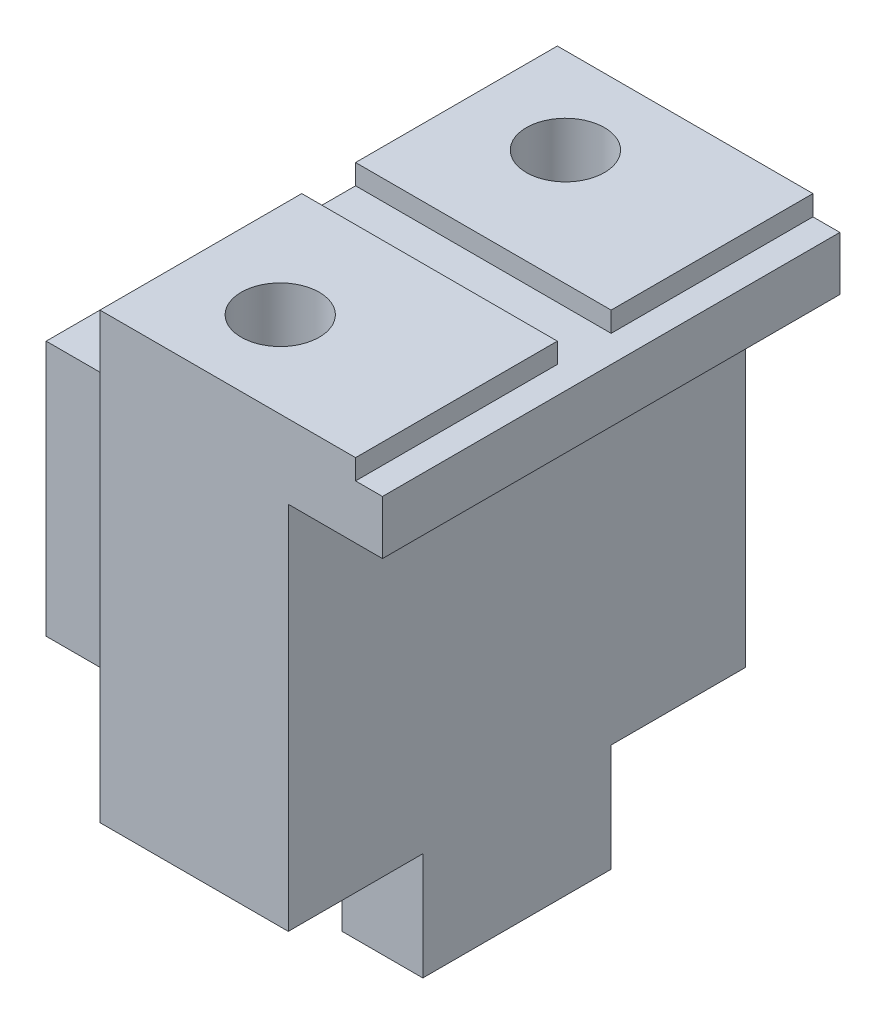
ISO-10303-21;
HEADER;
FILE_DESCRIPTION(('STEP AP214'),'2;1');
FILE_NAME('part.step','',(''),(''),'','','');
FILE_SCHEMA(('AUTOMOTIVE_DESIGN { 1 0 10303 214 1 1 1 1 }'));
ENDSEC;
DATA;
#1=APPLICATION_CONTEXT('core data for automotive mechanical design processes');
#2=APPLICATION_PROTOCOL_DEFINITION('international standard','automotive_design',2000,#1);
#3=PRODUCT_CONTEXT('',#1,'mechanical');
#4=PRODUCT('Part','Part','',(#3));
#5=PRODUCT_RELATED_PRODUCT_CATEGORY('part','',(#4));
#6=PRODUCT_DEFINITION_FORMATION('','',#4);
#7=PRODUCT_DEFINITION_CONTEXT('part definition',#1,'design');
#8=PRODUCT_DEFINITION('design','',#6,#7);
#9=PRODUCT_DEFINITION_SHAPE('','',#8);
#10=(LENGTH_UNIT() NAMED_UNIT(*) SI_UNIT(.MILLI.,.METRE.));
#11=(NAMED_UNIT(*) PLANE_ANGLE_UNIT() SI_UNIT($,.RADIAN.));
#12=(NAMED_UNIT(*) SI_UNIT($,.STERADIAN.) SOLID_ANGLE_UNIT());
#13=UNCERTAINTY_MEASURE_WITH_UNIT(LENGTH_MEASURE(1.E-05),#10,'distance_accuracy_value','');
#14=(GEOMETRIC_REPRESENTATION_CONTEXT(3) GLOBAL_UNCERTAINTY_ASSIGNED_CONTEXT((#13)) GLOBAL_UNIT_ASSIGNED_CONTEXT((#10,
#11,#12)) REPRESENTATION_CONTEXT('',''));
#15=CARTESIAN_POINT('',(0.,0.,0.));
#16=DIRECTION('',(0.,0.,1.));
#17=DIRECTION('',(1.,0.,0.));
#18=AXIS2_PLACEMENT_3D('',#15,#16,#17);
#19=CARTESIAN_POINT('',(9.5,15.75,7.));
#20=DIRECTION('',(-1.,0.,0.));
#21=DIRECTION('',(0.,0.,1.));
#22=AXIS2_PLACEMENT_3D('',#19,#20,#21);
#23=PLANE('',#22);
#24=DIRECTION('',(0.,0.,-1.));
#25=VECTOR('',#24,1.);
#26=CARTESIAN_POINT('',(9.5,15.75,7.));
#27=LINE('',#26,#25);
#28=CARTESIAN_POINT('',(9.5,15.75,12.));
#29=VERTEX_POINT('',#28);
#30=CARTESIAN_POINT('',(9.5,15.75,4.5));
#31=VERTEX_POINT('',#30);
#32=EDGE_CURVE('E172',#29,#31,#27,.T.);
#33=ORIENTED_EDGE('',*,*,#32,.T.);
#34=DIRECTION('',(0.,-1.,0.));
#35=VECTOR('',#34,1.);
#36=CARTESIAN_POINT('',(9.5,15.75,4.5));
#37=LINE('',#36,#35);
#38=CARTESIAN_POINT('',(9.5,16.5,4.5));
#39=VERTEX_POINT('',#38);
#40=EDGE_CURVE('E180',#39,#31,#37,.T.);
#41=ORIENTED_EDGE('',*,*,#40,.F.);
#42=DIRECTION('',(0.,0.,-1.));
#43=VECTOR('',#42,1.);
#44=CARTESIAN_POINT('',(9.5,16.5,7.));
#45=LINE('',#44,#43);
#46=CARTESIAN_POINT('',(9.5,16.5,12.));
#47=VERTEX_POINT('',#46);
#48=EDGE_CURVE('E195',#47,#39,#45,.T.);
#49=ORIENTED_EDGE('',*,*,#48,.F.);
#50=DIRECTION('',(0.,1.,0.));
#51=VECTOR('',#50,1.);
#52=CARTESIAN_POINT('',(9.5,15.75,12.));
#53=LINE('',#52,#51);
#54=EDGE_CURVE('E189',#29,#47,#53,.T.);
#55=ORIENTED_EDGE('',*,*,#54,.F.);
#56=EDGE_LOOP('',(#33,#41,#49,#55));
#57=FACE_BOUND('',#56,.T.);
#58=ADVANCED_FACE('F32',(#57),#23,.F.);
#59=CARTESIAN_POINT('',(7.,16.5,7.));
#60=DIRECTION('',(0.,-1.,0.));
#61=DIRECTION('',(0.,0.,-1.));
#62=AXIS2_PLACEMENT_3D('',#59,#60,#61);
#63=PLANE('',#62);
#64=CARTESIAN_POINT('',(3.5,16.5,8.8));
#65=DIRECTION('',(0.,1.,0.));
#66=DIRECTION('',(0.,0.,-1.));
#67=AXIS2_PLACEMENT_3D('',#64,#65,#66);
#68=CIRCLE('',#67,1.45);
#69=CARTESIAN_POINT('',(3.5,16.5,7.35));
#70=VERTEX_POINT('',#69);
#71=EDGE_CURVE('E337',#70,#70,#68,.T.);
#72=ORIENTED_EDGE('',*,*,#71,.F.);
#73=EDGE_LOOP('',(#72));
#74=FACE_BOUND('',#73,.T.);
#75=ORIENTED_EDGE('',*,*,#48,.T.);
#76=DIRECTION('',(1.,0.,0.));
#77=VECTOR('',#76,1.);
#78=CARTESIAN_POINT('',(-0.499999999999999,16.5,4.5));
#79=LINE('',#78,#77);
#80=CARTESIAN_POINT('',(0.,16.5,4.5));
#81=VERTEX_POINT('',#80);
#82=EDGE_CURVE('E183',#81,#39,#79,.T.);
#83=ORIENTED_EDGE('',*,*,#82,.F.);
#84=DIRECTION('',(0.,0.,-1.));
#85=VECTOR('',#84,1.);
#86=CARTESIAN_POINT('',(0.,16.5,7.));
#87=LINE('',#86,#85);
#88=CARTESIAN_POINT('',(0.,16.5,12.));
#89=VERTEX_POINT('',#88);
#90=EDGE_CURVE('E237',#89,#81,#87,.T.);
#91=ORIENTED_EDGE('',*,*,#90,.F.);
#92=DIRECTION('',(-1.,0.,0.));
#93=VECTOR('',#92,1.);
#94=CARTESIAN_POINT('',(9.5,16.5,12.));
#95=LINE('',#94,#93);
#96=EDGE_CURVE('E333',#47,#89,#95,.T.);
#97=ORIENTED_EDGE('',*,*,#96,.F.);
#98=EDGE_LOOP('',(#75,#83,#91,#97));
#99=FACE_BOUND('',#98,.T.);
#100=ADVANCED_FACE('F394',(#74,#99),#63,.F.);
#101=CARTESIAN_POINT('',(0.,0.,7.));
#102=DIRECTION('',(0.,0.,-1.));
#103=DIRECTION('',(-1.,0.,0.));
#104=AXIS2_PLACEMENT_3D('',#101,#102,#103);
#105=PLANE('',#104);
#106=DIRECTION('',(0.,1.,0.));
#107=VECTOR('',#106,1.);
#108=CARTESIAN_POINT('',(7.,0.,7.));
#109=LINE('',#108,#107);
#110=CARTESIAN_POINT('',(7.,-4.,7.));
#111=VERTEX_POINT('',#110);
#112=CARTESIAN_POINT('',(7.,0.,7.));
#113=VERTEX_POINT('',#112);
#114=EDGE_CURVE('E55',#111,#113,#109,.T.);
#115=ORIENTED_EDGE('',*,*,#114,.T.);
#116=DIRECTION('',(-1.,0.,0.));
#117=VECTOR('',#116,1.);
#118=CARTESIAN_POINT('',(0.,0.,7.));
#119=LINE('',#118,#117);
#120=CARTESIAN_POINT('',(4.,0.,7.));
#121=VERTEX_POINT('',#120);
#122=EDGE_CURVE('E281',#113,#121,#119,.T.);
#123=ORIENTED_EDGE('',*,*,#122,.T.);
#124=DIRECTION('',(0.,-1.,0.));
#125=VECTOR('',#124,1.);
#126=CARTESIAN_POINT('',(4.,0.,7.));
#127=LINE('',#126,#125);
#128=CARTESIAN_POINT('',(4.,-4.,7.));
#129=VERTEX_POINT('',#128);
#130=EDGE_CURVE('E273',#121,#129,#127,.T.);
#131=ORIENTED_EDGE('',*,*,#130,.T.);
#132=DIRECTION('',(1.,0.,0.));
#133=VECTOR('',#132,1.);
#134=CARTESIAN_POINT('',(7.,-4.,7.));
#135=LINE('',#134,#133);
#136=EDGE_CURVE('E271',#129,#111,#135,.T.);
#137=ORIENTED_EDGE('',*,*,#136,.T.);
#138=EDGE_LOOP('',(#115,#123,#131,#137));
#139=FACE_BOUND('',#138,.T.);
#140=ADVANCED_FACE('F383',(#139),#105,.F.);
#141=CARTESIAN_POINT('',(0.,0.,0.));
#142=DIRECTION('',(0.,0.,-1.));
#143=DIRECTION('',(-1.,0.,0.));
#144=AXIS2_PLACEMENT_3D('',#141,#142,#143);
#145=PLANE('',#144);
#146=DIRECTION('',(-1.,0.,0.));
#147=VECTOR('',#146,1.);
#148=CARTESIAN_POINT('',(0.,0.,0.));
#149=LINE('',#148,#147);
#150=CARTESIAN_POINT('',(7.,0.,0.));
#151=VERTEX_POINT('',#150);
#152=CARTESIAN_POINT('',(4.,0.,0.));
#153=VERTEX_POINT('',#152);
#154=EDGE_CURVE('E218',#151,#153,#149,.T.);
#155=ORIENTED_EDGE('',*,*,#154,.F.);
#156=DIRECTION('',(0.,1.,0.));
#157=VECTOR('',#156,1.);
#158=CARTESIAN_POINT('',(7.,0.,0.));
#159=LINE('',#158,#157);
#160=CARTESIAN_POINT('',(7.,-4.,0.));
#161=VERTEX_POINT('',#160);
#162=EDGE_CURVE('E256',#161,#151,#159,.T.);
#163=ORIENTED_EDGE('',*,*,#162,.F.);
#164=DIRECTION('',(1.,0.,0.));
#165=VECTOR('',#164,1.);
#166=CARTESIAN_POINT('',(7.,-4.,0.));
#167=LINE('',#166,#165);
#168=CARTESIAN_POINT('',(4.,-4.,0.));
#169=VERTEX_POINT('',#168);
#170=EDGE_CURVE('E259',#169,#161,#167,.T.);
#171=ORIENTED_EDGE('',*,*,#170,.F.);
#172=DIRECTION('',(0.,-1.,0.));
#173=VECTOR('',#172,1.);
#174=CARTESIAN_POINT('',(4.,0.,0.));
#175=LINE('',#174,#173);
#176=EDGE_CURVE('E262',#153,#169,#175,.T.);
#177=ORIENTED_EDGE('',*,*,#176,.F.);
#178=EDGE_LOOP('',(#155,#163,#171,#177));
#179=FACE_BOUND('',#178,.T.);
#180=ADVANCED_FACE('F390',(#179),#145,.T.);
#181=CARTESIAN_POINT('',(-3.5,-4.40000000000001,3.5));
#182=DIRECTION('',(0.,1.,0.));
#183=DIRECTION('',(-1.,0.,0.));
#184=AXIS2_PLACEMENT_3D('',#181,#182,#183);
#185=CYLINDRICAL_SURFACE('',#184,1.6);
#186=CARTESIAN_POINT('',(-3.5,0.,3.5));
#187=DIRECTION('',(0.,1.,0.));
#188=DIRECTION('',(0.,0.,1.));
#189=AXIS2_PLACEMENT_3D('',#186,#187,#188);
#190=CIRCLE('',#189,1.6);
#191=CARTESIAN_POINT('',(-3.5,0.,5.1));
#192=VERTEX_POINT('',#191);
#193=EDGE_CURVE('E215',#192,#192,#190,.T.);
#194=ORIENTED_EDGE('',*,*,#193,.F.);
#195=EDGE_LOOP('',(#194));
#196=FACE_BOUND('',#195,.T.);
#197=CARTESIAN_POINT('',(-3.5,6.5,3.5));
#198=DIRECTION('',(0.,1.,0.));
#199=DIRECTION('',(-1.,0.,0.));
#200=AXIS2_PLACEMENT_3D('',#197,#198,#199);
#201=CIRCLE('',#200,1.6);
#202=CARTESIAN_POINT('',(-5.1,6.5,3.5));
#203=VERTEX_POINT('',#202);
#204=EDGE_CURVE('E212',#203,#203,#201,.F.);
#205=ORIENTED_EDGE('',*,*,#204,.F.);
#206=EDGE_LOOP('',(#205));
#207=FACE_BOUND('',#206,.T.);
#208=ADVANCED_FACE('F433',(#196,#207),#185,.F.);
#209=CARTESIAN_POINT('',(0.,0.,7.));
#210=DIRECTION('',(0.,1.,0.));
#211=DIRECTION('',(0.,0.,1.));
#212=AXIS2_PLACEMENT_3D('',#209,#210,#211);
#213=PLANE('',#212);
#214=ORIENTED_EDGE('',*,*,#193,.T.);
#215=EDGE_LOOP('',(#214));
#216=FACE_BOUND('',#215,.T.);
#217=DIRECTION('',(1.,0.,0.));
#218=VECTOR('',#217,1.);
#219=CARTESIAN_POINT('',(0.,0.,0.));
#220=LINE('',#219,#218);
#221=CARTESIAN_POINT('',(-7.,0.,0.));
#222=VERTEX_POINT('',#221);
#223=CARTESIAN_POINT('',(0.,0.,0.));
#224=VERTEX_POINT('',#223);
#225=EDGE_CURVE('E264',#222,#224,#220,.T.);
#226=ORIENTED_EDGE('',*,*,#225,.T.);
#227=DIRECTION('',(0.,0.,1.));
#228=VECTOR('',#227,1.);
#229=CARTESIAN_POINT('',(0.,0.,-5.));
#230=LINE('',#229,#228);
#231=CARTESIAN_POINT('',(0.,0.,-5.));
#232=VERTEX_POINT('',#231);
#233=EDGE_CURVE('E289',#232,#224,#230,.T.);
#234=ORIENTED_EDGE('',*,*,#233,.F.);
#235=DIRECTION('',(1.,0.,0.));
#236=VECTOR('',#235,1.);
#237=CARTESIAN_POINT('',(0.,0.,-5.));
#238=LINE('',#237,#236);
#239=CARTESIAN_POINT('',(7.,0.,-5.));
#240=VERTEX_POINT('',#239);
#241=EDGE_CURVE('E309',#232,#240,#238,.T.);
#242=ORIENTED_EDGE('',*,*,#241,.T.);
#243=DIRECTION('',(0.,0.,1.));
#244=VECTOR('',#243,1.);
#245=CARTESIAN_POINT('',(7.,0.,-5.));
#246=LINE('',#245,#244);
#247=EDGE_CURVE('E288',#240,#151,#246,.T.);
#248=ORIENTED_EDGE('',*,*,#247,.T.);
#249=ORIENTED_EDGE('',*,*,#154,.T.);
#250=DIRECTION('',(0.,0.,-1.));
#251=VECTOR('',#250,1.);
#252=CARTESIAN_POINT('',(4.,0.,7.));
#253=LINE('',#252,#251);
#254=EDGE_CURVE('E208',#121,#153,#253,.T.);
#255=ORIENTED_EDGE('',*,*,#254,.F.);
#256=ORIENTED_EDGE('',*,*,#122,.F.);
#257=CARTESIAN_POINT('',(7.,0.,12.));
#258=VERTEX_POINT('',#257);
#259=EDGE_CURVE('E291',#113,#258,#246,.T.);
#260=ORIENTED_EDGE('',*,*,#259,.T.);
#261=DIRECTION('',(1.,0.,0.));
#262=VECTOR('',#261,1.);
#263=CARTESIAN_POINT('',(0.,0.,12.));
#264=LINE('',#263,#262);
#265=CARTESIAN_POINT('',(0.,0.,12.));
#266=VERTEX_POINT('',#265);
#267=EDGE_CURVE('E327',#266,#258,#264,.T.);
#268=ORIENTED_EDGE('',*,*,#267,.F.);
#269=CARTESIAN_POINT('',(0.,0.,7.));
#270=VERTEX_POINT('',#269);
#271=EDGE_CURVE('E292',#270,#266,#230,.T.);
#272=ORIENTED_EDGE('',*,*,#271,.F.);
#273=DIRECTION('',(1.,0.,0.));
#274=VECTOR('',#273,1.);
#275=CARTESIAN_POINT('',(0.,0.,7.));
#276=LINE('',#275,#274);
#277=CARTESIAN_POINT('',(-7.,0.,7.));
#278=VERTEX_POINT('',#277);
#279=EDGE_CURVE('E253',#278,#270,#276,.T.);
#280=ORIENTED_EDGE('',*,*,#279,.F.);
#281=DIRECTION('',(0.,0.,-1.));
#282=VECTOR('',#281,1.);
#283=CARTESIAN_POINT('',(-7.,0.,7.));
#284=LINE('',#283,#282);
#285=EDGE_CURVE('E246',#278,#222,#284,.T.);
#286=ORIENTED_EDGE('',*,*,#285,.T.);
#287=EDGE_LOOP('',(#226,#234,#242,#248,#249,#255,#256,#260,#268,#272,#280,#286));
#288=FACE_BOUND('',#287,.T.);
#289=ADVANCED_FACE('F34',(#216,#288),#213,.F.);
#290=CARTESIAN_POINT('',(4.,0.,7.));
#291=DIRECTION('',(1.,0.,0.));
#292=DIRECTION('',(0.,0.,-1.));
#293=AXIS2_PLACEMENT_3D('',#290,#291,#292);
#294=PLANE('',#293);
#295=ORIENTED_EDGE('',*,*,#176,.T.);
#296=DIRECTION('',(0.,0.,-1.));
#297=VECTOR('',#296,1.);
#298=CARTESIAN_POINT('',(4.,-4.,7.));
#299=LINE('',#298,#297);
#300=EDGE_CURVE('E205',#129,#169,#299,.T.);
#301=ORIENTED_EDGE('',*,*,#300,.F.);
#302=ORIENTED_EDGE('',*,*,#130,.F.);
#303=ORIENTED_EDGE('',*,*,#254,.T.);
#304=EDGE_LOOP('',(#295,#301,#302,#303));
#305=FACE_BOUND('',#304,.T.);
#306=ADVANCED_FACE('F426',(#305),#294,.F.);
#307=CARTESIAN_POINT('',(7.,-4.,7.));
#308=DIRECTION('',(0.,1.,0.));
#309=DIRECTION('',(0.,0.,1.));
#310=AXIS2_PLACEMENT_3D('',#307,#308,#309);
#311=PLANE('',#310);
#312=ORIENTED_EDGE('',*,*,#170,.T.);
#313=DIRECTION('',(0.,0.,-1.));
#314=VECTOR('',#313,1.);
#315=CARTESIAN_POINT('',(7.,-4.,7.));
#316=LINE('',#315,#314);
#317=EDGE_CURVE('E202',#111,#161,#316,.T.);
#318=ORIENTED_EDGE('',*,*,#317,.F.);
#319=ORIENTED_EDGE('',*,*,#136,.F.);
#320=ORIENTED_EDGE('',*,*,#300,.T.);
#321=EDGE_LOOP('',(#312,#318,#319,#320));
#322=FACE_BOUND('',#321,.T.);
#323=ADVANCED_FACE('F423',(#322),#311,.F.);
#324=CARTESIAN_POINT('',(7.,0.,7.));
#325=DIRECTION('',(-1.,0.,0.));
#326=DIRECTION('',(0.,0.,1.));
#327=AXIS2_PLACEMENT_3D('',#324,#325,#326);
#328=PLANE('',#327);
#329=ORIENTED_EDGE('',*,*,#162,.T.);
#330=ORIENTED_EDGE('',*,*,#247,.F.);
#331=DIRECTION('',(0.,1.,0.));
#332=VECTOR('',#331,1.);
#333=CARTESIAN_POINT('',(7.,13.75,-5.));
#334=LINE('',#333,#332);
#335=CARTESIAN_POINT('',(7.,13.75,-5.));
#336=VERTEX_POINT('',#335);
#337=EDGE_CURVE('E306',#240,#336,#334,.T.);
#338=ORIENTED_EDGE('',*,*,#337,.T.);
#339=DIRECTION('',(0.,0.,-1.));
#340=VECTOR('',#339,1.);
#341=CARTESIAN_POINT('',(7.,13.75,7.));
#342=LINE('',#341,#340);
#343=CARTESIAN_POINT('',(7.,13.75,12.));
#344=VERTEX_POINT('',#343);
#345=EDGE_CURVE('E200',#344,#336,#342,.T.);
#346=ORIENTED_EDGE('',*,*,#345,.F.);
#347=DIRECTION('',(0.,1.,0.));
#348=VECTOR('',#347,1.);
#349=CARTESIAN_POINT('',(7.,13.75,12.));
#350=LINE('',#349,#348);
#351=EDGE_CURVE('E324',#258,#344,#350,.T.);
#352=ORIENTED_EDGE('',*,*,#351,.F.);
#353=ORIENTED_EDGE('',*,*,#259,.F.);
#354=ORIENTED_EDGE('',*,*,#114,.F.);
#355=ORIENTED_EDGE('',*,*,#317,.T.);
#356=EDGE_LOOP('',(#329,#330,#338,#346,#352,#353,#354,#355));
#357=FACE_BOUND('',#356,.T.);
#358=ADVANCED_FACE('F419',(#357),#328,.F.);
#359=CARTESIAN_POINT('',(7.,13.75,7.));
#360=DIRECTION('',(0.,1.,0.));
#361=DIRECTION('',(0.,0.,1.));
#362=AXIS2_PLACEMENT_3D('',#359,#360,#361);
#363=PLANE('',#362);
#364=ORIENTED_EDGE('',*,*,#345,.T.);
#365=DIRECTION('',(1.,0.,0.));
#366=VECTOR('',#365,1.);
#367=CARTESIAN_POINT('',(7.,13.75,-5.));
#368=LINE('',#367,#366);
#369=CARTESIAN_POINT('',(10.5,13.75,-5.));
#370=VERTEX_POINT('',#369);
#371=EDGE_CURVE('E303',#336,#370,#368,.T.);
#372=ORIENTED_EDGE('',*,*,#371,.T.);
#373=DIRECTION('',(0.,0.,-1.));
#374=VECTOR('',#373,1.);
#375=CARTESIAN_POINT('',(10.5,13.75,7.));
#376=LINE('',#375,#374);
#377=CARTESIAN_POINT('',(10.5,13.75,12.));
#378=VERTEX_POINT('',#377);
#379=EDGE_CURVE('E193',#378,#370,#376,.T.);
#380=ORIENTED_EDGE('',*,*,#379,.F.);
#381=DIRECTION('',(1.,0.,0.));
#382=VECTOR('',#381,1.);
#383=CARTESIAN_POINT('',(7.,13.75,12.));
#384=LINE('',#383,#382);
#385=EDGE_CURVE('E321',#344,#378,#384,.T.);
#386=ORIENTED_EDGE('',*,*,#385,.F.);
#387=EDGE_LOOP('',(#364,#372,#380,#386));
#388=FACE_BOUND('',#387,.T.);
#389=ADVANCED_FACE('F413',(#388),#363,.F.);
#390=CARTESIAN_POINT('',(10.5,15.75,7.));
#391=DIRECTION('',(-1.,0.,0.));
#392=DIRECTION('',(0.,0.,1.));
#393=AXIS2_PLACEMENT_3D('',#390,#391,#392);
#394=PLANE('',#393);
#395=ORIENTED_EDGE('',*,*,#379,.T.);
#396=DIRECTION('',(0.,1.,0.));
#397=VECTOR('',#396,1.);
#398=CARTESIAN_POINT('',(10.5,13.75,-5.));
#399=LINE('',#398,#397);
#400=CARTESIAN_POINT('',(10.5,15.75,-5.));
#401=VERTEX_POINT('',#400);
#402=EDGE_CURVE('E300',#370,#401,#399,.T.);
#403=ORIENTED_EDGE('',*,*,#402,.T.);
#404=DIRECTION('',(0.,0.,-1.));
#405=VECTOR('',#404,1.);
#406=CARTESIAN_POINT('',(10.5,15.75,7.));
#407=LINE('',#406,#405);
#408=CARTESIAN_POINT('',(10.5,15.75,12.));
#409=VERTEX_POINT('',#408);
#410=EDGE_CURVE('E190',#409,#401,#407,.T.);
#411=ORIENTED_EDGE('',*,*,#410,.F.);
#412=DIRECTION('',(0.,1.,0.));
#413=VECTOR('',#412,1.);
#414=CARTESIAN_POINT('',(10.5,13.75,12.));
#415=LINE('',#414,#413);
#416=EDGE_CURVE('E318',#378,#409,#415,.T.);
#417=ORIENTED_EDGE('',*,*,#416,.F.);
#418=EDGE_LOOP('',(#395,#403,#411,#417));
#419=FACE_BOUND('',#418,.T.);
#420=ADVANCED_FACE('F409',(#419),#394,.F.);
#421=CARTESIAN_POINT('',(9.5,15.75,7.));
#422=DIRECTION('',(0.,-1.,0.));
#423=DIRECTION('',(0.,0.,-1.));
#424=AXIS2_PLACEMENT_3D('',#421,#422,#423);
#425=PLANE('',#424);
#426=ORIENTED_EDGE('',*,*,#410,.T.);
#427=DIRECTION('',(-1.,0.,0.));
#428=VECTOR('',#427,1.);
#429=CARTESIAN_POINT('',(10.5,15.75,-5.));
#430=LINE('',#429,#428);
#431=CARTESIAN_POINT('',(9.5,15.75,-5.));
#432=VERTEX_POINT('',#431);
#433=EDGE_CURVE('E297',#401,#432,#430,.T.);
#434=ORIENTED_EDGE('',*,*,#433,.T.);
#435=CARTESIAN_POINT('',(9.5,15.75,2.5));
#436=VERTEX_POINT('',#435);
#437=EDGE_CURVE('E191',#436,#432,#27,.T.);
#438=ORIENTED_EDGE('',*,*,#437,.F.);
#439=DIRECTION('',(1.,0.,0.));
#440=VECTOR('',#439,1.);
#441=CARTESIAN_POINT('',(-0.499999999999999,15.75,2.5));
#442=LINE('',#441,#440);
#443=CARTESIAN_POINT('',(0.,15.75,2.5));
#444=VERTEX_POINT('',#443);
#445=EDGE_CURVE('E47',#444,#436,#442,.T.);
#446=ORIENTED_EDGE('',*,*,#445,.F.);
#447=DIRECTION('',(0.,0.,-1.));
#448=VECTOR('',#447,1.);
#449=CARTESIAN_POINT('',(0.,15.75,7.));
#450=LINE('',#449,#448);
#451=CARTESIAN_POINT('',(0.,15.75,4.5));
#452=VERTEX_POINT('',#451);
#453=EDGE_CURVE('E175',#452,#444,#450,.T.);
#454=ORIENTED_EDGE('',*,*,#453,.F.);
#455=DIRECTION('',(1.,0.,0.));
#456=VECTOR('',#455,1.);
#457=CARTESIAN_POINT('',(-0.499999999999999,15.75,4.5));
#458=LINE('',#457,#456);
#459=EDGE_CURVE('E167',#452,#31,#458,.T.);
#460=ORIENTED_EDGE('',*,*,#459,.T.);
#461=ORIENTED_EDGE('',*,*,#32,.F.);
#462=DIRECTION('',(-1.,0.,0.));
#463=VECTOR('',#462,1.);
#464=CARTESIAN_POINT('',(10.5,15.75,12.));
#465=LINE('',#464,#463);
#466=EDGE_CURVE('E316',#409,#29,#465,.T.);
#467=ORIENTED_EDGE('',*,*,#466,.F.);
#468=EDGE_LOOP('',(#426,#434,#438,#446,#454,#460,#461,#467));
#469=FACE_BOUND('',#468,.T.);
#470=ADVANCED_FACE('F169',(#469),#425,.F.);
#471=CARTESIAN_POINT('',(9.5,16.5,2.5));
#472=VERTEX_POINT('',#471);
#473=CARTESIAN_POINT('',(9.5,16.5,-5.));
#474=VERTEX_POINT('',#473);
#475=EDGE_CURVE('E239',#472,#474,#45,.T.);
#476=ORIENTED_EDGE('',*,*,#475,.F.);
#477=DIRECTION('',(0.,1.,0.));
#478=VECTOR('',#477,1.);
#479=CARTESIAN_POINT('',(9.5,15.75,2.5));
#480=LINE('',#479,#478);
#481=EDGE_CURVE('E177',#436,#472,#480,.T.);
#482=ORIENTED_EDGE('',*,*,#481,.F.);
#483=ORIENTED_EDGE('',*,*,#437,.T.);
#484=DIRECTION('',(0.,1.,0.));
#485=VECTOR('',#484,1.);
#486=CARTESIAN_POINT('',(9.5,15.75,-5.));
#487=LINE('',#486,#485);
#488=EDGE_CURVE('E294',#432,#474,#487,.T.);
#489=ORIENTED_EDGE('',*,*,#488,.T.);
#490=EDGE_LOOP('',(#476,#482,#483,#489));
#491=FACE_BOUND('',#490,.T.);
#492=ADVANCED_FACE('F354',(#491),#23,.F.);
#493=CARTESIAN_POINT('',(3.5,16.5,-1.8));
#494=DIRECTION('',(0.,1.,0.));
#495=DIRECTION('',(0.,0.,1.));
#496=AXIS2_PLACEMENT_3D('',#493,#494,#495);
#497=CIRCLE('',#496,1.45);
#498=CARTESIAN_POINT('',(3.5,16.5,-0.35));
#499=VERTEX_POINT('',#498);
#500=EDGE_CURVE('E343',#499,#499,#497,.T.);
#501=ORIENTED_EDGE('',*,*,#500,.F.);
#502=EDGE_LOOP('',(#501));
#503=FACE_BOUND('',#502,.T.);
#504=CARTESIAN_POINT('',(0.,16.5,2.5));
#505=VERTEX_POINT('',#504);
#506=CARTESIAN_POINT('',(0.,16.5,-5.));
#507=VERTEX_POINT('',#506);
#508=EDGE_CURVE('E226',#505,#507,#87,.T.);
#509=ORIENTED_EDGE('',*,*,#508,.F.);
#510=DIRECTION('',(1.,0.,0.));
#511=VECTOR('',#510,1.);
#512=CARTESIAN_POINT('',(-0.499999999999999,16.5,2.5));
#513=LINE('',#512,#511);
#514=EDGE_CURVE('E233',#505,#472,#513,.T.);
#515=ORIENTED_EDGE('',*,*,#514,.T.);
#516=ORIENTED_EDGE('',*,*,#475,.T.);
#517=DIRECTION('',(-1.,0.,0.));
#518=VECTOR('',#517,1.);
#519=CARTESIAN_POINT('',(9.5,16.5,-5.));
#520=LINE('',#519,#518);
#521=EDGE_CURVE('E236',#474,#507,#520,.T.);
#522=ORIENTED_EDGE('',*,*,#521,.T.);
#523=EDGE_LOOP('',(#509,#515,#516,#522));
#524=FACE_BOUND('',#523,.T.);
#525=ADVANCED_FACE('F232',(#503,#524),#63,.F.);
#526=CARTESIAN_POINT('',(0.,9.5,7.));
#527=DIRECTION('',(1.,0.,0.));
#528=DIRECTION('',(0.,0.,-1.));
#529=AXIS2_PLACEMENT_3D('',#526,#527,#528);
#530=PLANE('',#529);
#531=ORIENTED_EDGE('',*,*,#90,.T.);
#532=DIRECTION('',(0.,-1.,0.));
#533=VECTOR('',#532,1.);
#534=CARTESIAN_POINT('',(0.,9.5,4.5));
#535=LINE('',#534,#533);
#536=EDGE_CURVE('E11',#81,#452,#535,.T.);
#537=ORIENTED_EDGE('',*,*,#536,.T.);
#538=ORIENTED_EDGE('',*,*,#453,.T.);
#539=DIRECTION('',(0.,1.,0.));
#540=VECTOR('',#539,1.);
#541=CARTESIAN_POINT('',(0.,9.5,2.5));
#542=LINE('',#541,#540);
#543=EDGE_CURVE('E40',#444,#505,#542,.T.);
#544=ORIENTED_EDGE('',*,*,#543,.T.);
#545=ORIENTED_EDGE('',*,*,#508,.T.);
#546=DIRECTION('',(0.,-1.,0.));
#547=VECTOR('',#546,1.);
#548=CARTESIAN_POINT('',(0.,16.5,-5.));
#549=LINE('',#548,#547);
#550=EDGE_CURVE('E312',#507,#232,#549,.T.);
#551=ORIENTED_EDGE('',*,*,#550,.T.);
#552=ORIENTED_EDGE('',*,*,#233,.T.);
#553=DIRECTION('',(0.,1.,0.));
#554=VECTOR('',#553,1.);
#555=CARTESIAN_POINT('',(0.,0.,0.));
#556=LINE('',#555,#554);
#557=CARTESIAN_POINT('',(0.,9.5,0.));
#558=VERTEX_POINT('',#557);
#559=EDGE_CURVE('E211',#224,#558,#556,.T.);
#560=ORIENTED_EDGE('',*,*,#559,.T.);
#561=DIRECTION('',(0.,0.,-1.));
#562=VECTOR('',#561,1.);
#563=CARTESIAN_POINT('',(0.,9.5,7.));
#564=LINE('',#563,#562);
#565=CARTESIAN_POINT('',(0.,9.5,7.));
#566=VERTEX_POINT('',#565);
#567=EDGE_CURVE('E238',#566,#558,#564,.T.);
#568=ORIENTED_EDGE('',*,*,#567,.F.);
#569=DIRECTION('',(0.,1.,0.));
#570=VECTOR('',#569,1.);
#571=CARTESIAN_POINT('',(0.,0.,7.));
#572=LINE('',#571,#570);
#573=EDGE_CURVE('E285',#270,#566,#572,.T.);
#574=ORIENTED_EDGE('',*,*,#573,.F.);
#575=ORIENTED_EDGE('',*,*,#271,.T.);
#576=DIRECTION('',(0.,-1.,0.));
#577=VECTOR('',#576,1.);
#578=CARTESIAN_POINT('',(0.,16.5,12.));
#579=LINE('',#578,#577);
#580=EDGE_CURVE('E330',#89,#266,#579,.T.);
#581=ORIENTED_EDGE('',*,*,#580,.F.);
#582=EDGE_LOOP('',(#531,#537,#538,#544,#545,#551,#552,#560,#568,#574,#575,#581));
#583=FACE_BOUND('',#582,.T.);
#584=ADVANCED_FACE('F224',(#583),#530,.F.);
#585=CARTESIAN_POINT('',(0.,9.5,7.));
#586=DIRECTION('',(0.,-1.,0.));
#587=DIRECTION('',(0.,0.,-1.));
#588=AXIS2_PLACEMENT_3D('',#585,#586,#587);
#589=PLANE('',#588);
#590=CARTESIAN_POINT('',(-3.5,9.5,3.5));
#591=DIRECTION('',(0.,1.,0.));
#592=DIRECTION('',(-1.,0.,0.));
#593=AXIS2_PLACEMENT_3D('',#590,#591,#592);
#594=CIRCLE('',#593,2.75);
#595=CARTESIAN_POINT('',(-6.25,9.5,3.5));
#596=VERTEX_POINT('',#595);
#597=EDGE_CURVE('E278',#596,#596,#594,.T.);
#598=ORIENTED_EDGE('',*,*,#597,.F.);
#599=EDGE_LOOP('',(#598));
#600=FACE_BOUND('',#599,.T.);
#601=DIRECTION('',(-1.,0.,0.));
#602=VECTOR('',#601,1.);
#603=CARTESIAN_POINT('',(0.,9.5,0.));
#604=LINE('',#603,#602);
#605=CARTESIAN_POINT('',(-7.,9.5,0.));
#606=VERTEX_POINT('',#605);
#607=EDGE_CURVE('E254',#558,#606,#604,.T.);
#608=ORIENTED_EDGE('',*,*,#607,.T.);
#609=DIRECTION('',(0.,0.,-1.));
#610=VECTOR('',#609,1.);
#611=CARTESIAN_POINT('',(-7.,9.5,7.));
#612=LINE('',#611,#610);
#613=CARTESIAN_POINT('',(-7.,9.5,7.));
#614=VERTEX_POINT('',#613);
#615=EDGE_CURVE('E241',#614,#606,#612,.T.);
#616=ORIENTED_EDGE('',*,*,#615,.F.);
#617=DIRECTION('',(-1.,0.,0.));
#618=VECTOR('',#617,1.);
#619=CARTESIAN_POINT('',(0.,9.5,7.));
#620=LINE('',#619,#618);
#621=EDGE_CURVE('E268',#566,#614,#620,.T.);
#622=ORIENTED_EDGE('',*,*,#621,.F.);
#623=ORIENTED_EDGE('',*,*,#567,.T.);
#624=EDGE_LOOP('',(#608,#616,#622,#623));
#625=FACE_BOUND('',#624,.T.);
#626=ADVANCED_FACE('F377',(#600,#625),#589,.F.);
#627=CARTESIAN_POINT('',(-7.,0.,7.));
#628=DIRECTION('',(1.,0.,0.));
#629=DIRECTION('',(0.,0.,-1.));
#630=AXIS2_PLACEMENT_3D('',#627,#628,#629);
#631=PLANE('',#630);
#632=DIRECTION('',(0.,-1.,0.));
#633=VECTOR('',#632,1.);
#634=CARTESIAN_POINT('',(-7.,0.,0.));
#635=LINE('',#634,#633);
#636=EDGE_CURVE('E250',#606,#222,#635,.T.);
#637=ORIENTED_EDGE('',*,*,#636,.T.);
#638=ORIENTED_EDGE('',*,*,#285,.F.);
#639=DIRECTION('',(0.,-1.,0.));
#640=VECTOR('',#639,1.);
#641=CARTESIAN_POINT('',(-7.,0.,7.));
#642=LINE('',#641,#640);
#643=EDGE_CURVE('E249',#614,#278,#642,.T.);
#644=ORIENTED_EDGE('',*,*,#643,.F.);
#645=ORIENTED_EDGE('',*,*,#615,.T.);
#646=EDGE_LOOP('',(#637,#638,#644,#645));
#647=FACE_BOUND('',#646,.T.);
#648=ADVANCED_FACE('F374',(#647),#631,.F.);
#649=ORIENTED_EDGE('',*,*,#279,.T.);
#650=ORIENTED_EDGE('',*,*,#573,.T.);
#651=ORIENTED_EDGE('',*,*,#621,.T.);
#652=ORIENTED_EDGE('',*,*,#643,.T.);
#653=EDGE_LOOP('',(#649,#650,#651,#652));
#654=FACE_BOUND('',#653,.T.);
#655=ADVANCED_FACE('F380',(#654),#105,.F.);
#656=ORIENTED_EDGE('',*,*,#559,.F.);
#657=ORIENTED_EDGE('',*,*,#225,.F.);
#658=ORIENTED_EDGE('',*,*,#636,.F.);
#659=ORIENTED_EDGE('',*,*,#607,.F.);
#660=EDGE_LOOP('',(#656,#657,#658,#659));
#661=FACE_BOUND('',#660,.T.);
#662=ADVANCED_FACE('F367',(#661),#145,.T.);
#663=CARTESIAN_POINT('',(-3.5,6.5,3.5));
#664=DIRECTION('',(0.,1.,0.));
#665=DIRECTION('',(-1.,0.,0.));
#666=AXIS2_PLACEMENT_3D('',#663,#664,#665);
#667=PLANE('',#666);
#668=CARTESIAN_POINT('',(-3.5,6.5,3.5));
#669=DIRECTION('',(0.,1.,0.));
#670=DIRECTION('',(-1.,0.,0.));
#671=AXIS2_PLACEMENT_3D('',#668,#669,#670);
#672=CIRCLE('',#671,2.75);
#673=CARTESIAN_POINT('',(-6.25,6.5,3.5));
#674=VERTEX_POINT('',#673);
#675=EDGE_CURVE('E216',#674,#674,#672,.T.);
#676=ORIENTED_EDGE('',*,*,#675,.T.);
#677=EDGE_LOOP('',(#676));
#678=FACE_BOUND('',#677,.T.);
#679=ORIENTED_EDGE('',*,*,#204,.T.);
#680=EDGE_LOOP('',(#679));
#681=FACE_BOUND('',#680,.T.);
#682=ADVANCED_FACE('F388',(#678,#681),#667,.T.);
#683=CARTESIAN_POINT('',(-3.5,6.5,3.5));
#684=DIRECTION('',(0.,1.,0.));
#685=DIRECTION('',(-1.,0.,0.));
#686=AXIS2_PLACEMENT_3D('',#683,#684,#685);
#687=CYLINDRICAL_SURFACE('',#686,2.75);
#688=ORIENTED_EDGE('',*,*,#675,.F.);
#689=EDGE_LOOP('',(#688));
#690=FACE_BOUND('',#689,.T.);
#691=ORIENTED_EDGE('',*,*,#597,.T.);
#692=EDGE_LOOP('',(#691));
#693=FACE_BOUND('',#692,.T.);
#694=ADVANCED_FACE('F465',(#690,#693),#687,.F.);
#695=CARTESIAN_POINT('',(0.,0.,-5.));
#696=DIRECTION('',(0.,0.,1.));
#697=DIRECTION('',(1.,0.,0.));
#698=AXIS2_PLACEMENT_3D('',#695,#696,#697);
#699=PLANE('',#698);
#700=ORIENTED_EDGE('',*,*,#521,.F.);
#701=ORIENTED_EDGE('',*,*,#488,.F.);
#702=ORIENTED_EDGE('',*,*,#433,.F.);
#703=ORIENTED_EDGE('',*,*,#402,.F.);
#704=ORIENTED_EDGE('',*,*,#371,.F.);
#705=ORIENTED_EDGE('',*,*,#337,.F.);
#706=ORIENTED_EDGE('',*,*,#241,.F.);
#707=ORIENTED_EDGE('',*,*,#550,.F.);
#708=EDGE_LOOP('',(#700,#701,#702,#703,#704,#705,#706,#707));
#709=FACE_BOUND('',#708,.T.);
#710=ADVANCED_FACE('F359',(#709),#699,.F.);
#711=CARTESIAN_POINT('',(0.,0.,12.));
#712=DIRECTION('',(0.,0.,1.));
#713=DIRECTION('',(1.,0.,0.));
#714=AXIS2_PLACEMENT_3D('',#711,#712,#713);
#715=PLANE('',#714);
#716=ORIENTED_EDGE('',*,*,#96,.T.);
#717=ORIENTED_EDGE('',*,*,#580,.T.);
#718=ORIENTED_EDGE('',*,*,#267,.T.);
#719=ORIENTED_EDGE('',*,*,#351,.T.);
#720=ORIENTED_EDGE('',*,*,#385,.T.);
#721=ORIENTED_EDGE('',*,*,#416,.T.);
#722=ORIENTED_EDGE('',*,*,#466,.T.);
#723=ORIENTED_EDGE('',*,*,#54,.T.);
#724=EDGE_LOOP('',(#716,#717,#718,#719,#720,#721,#722,#723));
#725=FACE_BOUND('',#724,.T.);
#726=ADVANCED_FACE('F448',(#725),#715,.T.);
#727=CARTESIAN_POINT('',(3.5,6.5,8.8));
#728=DIRECTION('',(0.,1.,0.));
#729=DIRECTION('',(0.,0.,1.));
#730=AXIS2_PLACEMENT_3D('',#727,#728,#729);
#731=CYLINDRICAL_SURFACE('',#730,1.45);
#732=CARTESIAN_POINT('',(3.5,6.5,8.8));
#733=DIRECTION('',(0.,1.,0.));
#734=DIRECTION('',(0.,0.,-1.));
#735=AXIS2_PLACEMENT_3D('',#732,#733,#734);
#736=CIRCLE('',#735,1.45);
#737=CARTESIAN_POINT('',(3.5,6.5,7.35));
#738=VERTEX_POINT('',#737);
#739=EDGE_CURVE('E340',#738,#738,#736,.T.);
#740=ORIENTED_EDGE('',*,*,#739,.F.);
#741=EDGE_LOOP('',(#740));
#742=FACE_BOUND('',#741,.T.);
#743=ORIENTED_EDGE('',*,*,#71,.T.);
#744=EDGE_LOOP('',(#743));
#745=FACE_BOUND('',#744,.T.);
#746=ADVANCED_FACE('F456',(#742,#745),#731,.F.);
#747=CARTESIAN_POINT('',(3.5,6.5,8.8));
#748=DIRECTION('',(0.,-1.,0.));
#749=DIRECTION('',(0.,0.,-1.));
#750=AXIS2_PLACEMENT_3D('',#747,#748,#749);
#751=PLANE('',#750);
#752=ORIENTED_EDGE('',*,*,#739,.T.);
#753=EDGE_LOOP('',(#752));
#754=FACE_BOUND('',#753,.T.);
#755=ADVANCED_FACE('F462',(#754),#751,.F.);
#756=CARTESIAN_POINT('',(3.5,6.5,-1.8));
#757=DIRECTION('',(0.,1.,0.));
#758=DIRECTION('',(0.,0.,1.));
#759=AXIS2_PLACEMENT_3D('',#756,#757,#758);
#760=CYLINDRICAL_SURFACE('',#759,1.45);
#761=CARTESIAN_POINT('',(3.5,6.5,-1.8));
#762=DIRECTION('',(0.,1.,0.));
#763=DIRECTION('',(0.,0.,1.));
#764=AXIS2_PLACEMENT_3D('',#761,#762,#763);
#765=CIRCLE('',#764,1.45);
#766=CARTESIAN_POINT('',(3.5,6.5,-0.35));
#767=VERTEX_POINT('',#766);
#768=EDGE_CURVE('E336',#767,#767,#765,.T.);
#769=ORIENTED_EDGE('',*,*,#768,.F.);
#770=EDGE_LOOP('',(#769));
#771=FACE_BOUND('',#770,.T.);
#772=ORIENTED_EDGE('',*,*,#500,.T.);
#773=EDGE_LOOP('',(#772));
#774=FACE_BOUND('',#773,.T.);
#775=ADVANCED_FACE('F624',(#771,#774),#760,.F.);
#776=CARTESIAN_POINT('',(3.5,6.5,-1.8));
#777=DIRECTION('',(0.,1.,0.));
#778=DIRECTION('',(0.,0.,1.));
#779=AXIS2_PLACEMENT_3D('',#776,#777,#778);
#780=PLANE('',#779);
#781=ORIENTED_EDGE('',*,*,#768,.T.);
#782=EDGE_LOOP('',(#781));
#783=FACE_BOUND('',#782,.T.);
#784=ADVANCED_FACE('F632',(#783),#780,.T.);
#785=CARTESIAN_POINT('',(-0.499999999999999,15.75,4.5));
#786=DIRECTION('',(0.,0.,1.));
#787=DIRECTION('',(1.,0.,0.));
#788=AXIS2_PLACEMENT_3D('',#785,#786,#787);
#789=PLANE('',#788);
#790=ORIENTED_EDGE('',*,*,#82,.T.);
#791=ORIENTED_EDGE('',*,*,#40,.T.);
#792=ORIENTED_EDGE('',*,*,#459,.F.);
#793=ORIENTED_EDGE('',*,*,#536,.F.);
#794=EDGE_LOOP('',(#790,#791,#792,#793));
#795=FACE_BOUND('',#794,.T.);
#796=ADVANCED_FACE('F181',(#795),#789,.F.);
#797=CARTESIAN_POINT('',(-0.499999999999999,15.75,2.5));
#798=DIRECTION('',(0.,0.,-1.));
#799=DIRECTION('',(-1.,0.,0.));
#800=AXIS2_PLACEMENT_3D('',#797,#798,#799);
#801=PLANE('',#800);
#802=ORIENTED_EDGE('',*,*,#445,.T.);
#803=ORIENTED_EDGE('',*,*,#481,.T.);
#804=ORIENTED_EDGE('',*,*,#514,.F.);
#805=ORIENTED_EDGE('',*,*,#543,.F.);
#806=EDGE_LOOP('',(#802,#803,#804,#805));
#807=FACE_BOUND('',#806,.T.);
#808=ADVANCED_FACE('F352',(#807),#801,.F.);
#809=CLOSED_SHELL('',(#58,#100,#140,#180,#208,#289,#306,#323,#358,#389,#420,#470,#492,#525,#584,
#626,#648,#655,#662,#682,#694,#710,#726,#746,#755,#775,#784,#796,#808));
#810=MANIFOLD_SOLID_BREP('B2',#809);
#811=ADVANCED_BREP_SHAPE_REPRESENTATION('',(#18,#810),#14);
#812=SHAPE_DEFINITION_REPRESENTATION(#9,#811);
ENDSEC;
END-ISO-10303-21;
